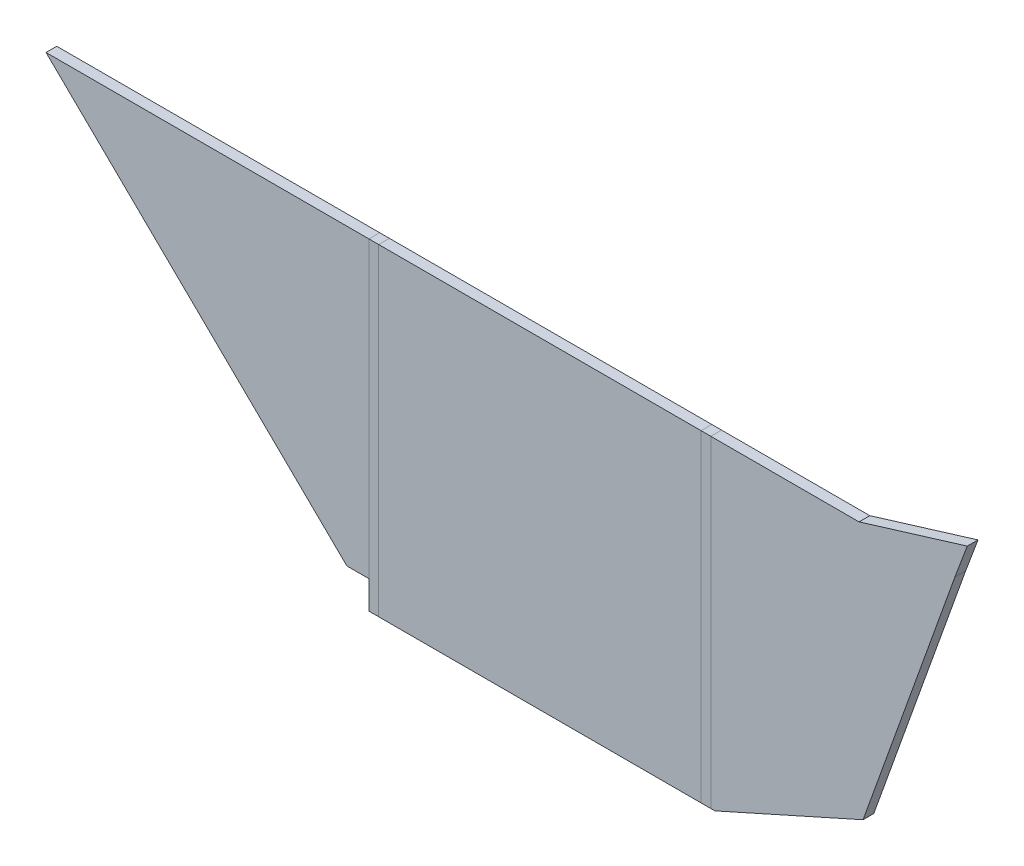
ISO-10303-21;
HEADER;
FILE_DESCRIPTION(('STEP AP214'),'2;1');
FILE_NAME('part.step','',(''),(''),'','','');
FILE_SCHEMA(('AUTOMOTIVE_DESIGN { 1 0 10303 214 1 1 1 1 }'));
ENDSEC;
DATA;
#1=APPLICATION_CONTEXT('core data for automotive mechanical design processes');
#2=APPLICATION_PROTOCOL_DEFINITION('international standard','automotive_design',2000,#1);
#3=PRODUCT_CONTEXT('',#1,'mechanical');
#4=PRODUCT('Part','Part','',(#3));
#5=PRODUCT_RELATED_PRODUCT_CATEGORY('part','',(#4));
#6=PRODUCT_DEFINITION_FORMATION('','',#4);
#7=PRODUCT_DEFINITION_CONTEXT('part definition',#1,'design');
#8=PRODUCT_DEFINITION('design','',#6,#7);
#9=PRODUCT_DEFINITION_SHAPE('','',#8);
#10=(LENGTH_UNIT() NAMED_UNIT(*) SI_UNIT(.MILLI.,.METRE.));
#11=(NAMED_UNIT(*) PLANE_ANGLE_UNIT() SI_UNIT($,.RADIAN.));
#12=(NAMED_UNIT(*) SI_UNIT($,.STERADIAN.) SOLID_ANGLE_UNIT());
#13=UNCERTAINTY_MEASURE_WITH_UNIT(LENGTH_MEASURE(1.E-05),#10,'distance_accuracy_value','');
#14=(GEOMETRIC_REPRESENTATION_CONTEXT(3) GLOBAL_UNCERTAINTY_ASSIGNED_CONTEXT((#13)) GLOBAL_UNIT_ASSIGNED_CONTEXT((#10,
#11,#12)) REPRESENTATION_CONTEXT('',''));
#15=CARTESIAN_POINT('',(0.,0.,0.));
#16=DIRECTION('',(0.,0.,1.));
#17=DIRECTION('',(1.,0.,0.));
#18=AXIS2_PLACEMENT_3D('',#15,#16,#17);
#19=CARTESIAN_POINT('',(-31.818563267408,30.,-1.00000000000001));
#20=DIRECTION('',(-1.,0.,0.));
#21=DIRECTION('',(0.,-1.,0.));
#22=AXIS2_PLACEMENT_3D('',#19,#20,#21);
#23=PLANE('',#22);
#24=DIRECTION('',(0.,-1.,0.));
#25=VECTOR('',#24,1.);
#26=CARTESIAN_POINT('',(-31.818563267408,30.,-1.00000000000001));
#27=LINE('',#26,#25);
#28=CARTESIAN_POINT('',(-31.818563267408,-24.77,-1.00000000000001));
#29=VERTEX_POINT('',#28);
#30=CARTESIAN_POINT('',(-31.818563267408,-30.,-1.00000000000001));
#31=VERTEX_POINT('',#30);
#32=EDGE_CURVE('E247',#29,#31,#27,.T.);
#33=ORIENTED_EDGE('',*,*,#32,.T.);
#34=DIRECTION('',(0.,0.,-1.));
#35=VECTOR('',#34,1.);
#36=CARTESIAN_POINT('',(-31.818563267408,-30.,-1.00000000000001));
#37=LINE('',#36,#35);
#38=CARTESIAN_POINT('',(-31.818563267408,-30.,1.));
#39=VERTEX_POINT('',#38);
#40=EDGE_CURVE('E253',#39,#31,#37,.T.);
#41=ORIENTED_EDGE('',*,*,#40,.F.);
#42=DIRECTION('',(0.,1.,0.));
#43=VECTOR('',#42,1.);
#44=CARTESIAN_POINT('',(-31.818563267408,0.,1.));
#45=LINE('',#44,#43);
#46=CARTESIAN_POINT('',(-31.818563267408,-24.77,1.));
#47=VERTEX_POINT('',#46);
#48=EDGE_CURVE('E254',#47,#39,#45,.F.);
#49=ORIENTED_EDGE('',*,*,#48,.F.);
#50=DIRECTION('',(0.,0.,1.));
#51=VECTOR('',#50,1.);
#52=CARTESIAN_POINT('',(-31.818563267408,-24.77,0.99999999999998));
#53=LINE('',#52,#51);
#54=EDGE_CURVE('E239',#29,#47,#53,.T.);
#55=ORIENTED_EDGE('',*,*,#54,.F.);
#56=EDGE_LOOP('',(#33,#41,#49,#55));
#57=FACE_BOUND('',#56,.T.);
#58=ADVANCED_FACE('F45',(#57),#23,.T.);
#59=CARTESIAN_POINT('',(30.,-30.,-1.));
#60=DIRECTION('',(0.,-1.,0.));
#61=DIRECTION('',(0.,0.,-1.));
#62=AXIS2_PLACEMENT_3D('',#59,#60,#61);
#63=PLANE('',#62);
#64=DIRECTION('',(-1.,0.,0.));
#65=VECTOR('',#64,1.);
#66=CARTESIAN_POINT('',(30.,-30.,1.));
#67=LINE('',#66,#65);
#68=CARTESIAN_POINT('',(30.,-30.,1.));
#69=VERTEX_POINT('',#68);
#70=CARTESIAN_POINT('',(-30.,-30.,1.));
#71=VERTEX_POINT('',#70);
#72=EDGE_CURVE('E267',#69,#71,#67,.T.);
#73=ORIENTED_EDGE('',*,*,#72,.T.);
#74=DIRECTION('',(0.,0.,1.));
#75=VECTOR('',#74,1.);
#76=CARTESIAN_POINT('',(-30.,-30.,-1.));
#77=LINE('',#76,#75);
#78=CARTESIAN_POINT('',(-30.,-30.,-1.00000000000001));
#79=VERTEX_POINT('',#78);
#80=EDGE_CURVE('E283',#79,#71,#77,.T.);
#81=ORIENTED_EDGE('',*,*,#80,.F.);
#82=DIRECTION('',(-1.,0.,0.));
#83=VECTOR('',#82,1.);
#84=CARTESIAN_POINT('',(30.,-30.,-1.));
#85=LINE('',#84,#83);
#86=CARTESIAN_POINT('',(30.,-30.,-0.99999999999999));
#87=VERTEX_POINT('',#86);
#88=EDGE_CURVE('E266',#87,#79,#85,.T.);
#89=ORIENTED_EDGE('',*,*,#88,.F.);
#90=DIRECTION('',(0.,0.,1.));
#91=VECTOR('',#90,1.);
#92=CARTESIAN_POINT('',(30.,-30.,-1.));
#93=LINE('',#92,#91);
#94=EDGE_CURVE('E289',#87,#69,#93,.T.);
#95=ORIENTED_EDGE('',*,*,#94,.T.);
#96=EDGE_LOOP('',(#73,#81,#89,#95));
#97=FACE_BOUND('',#96,.T.);
#98=ADVANCED_FACE('F299',(#97),#63,.T.);
#99=CARTESIAN_POINT('',(30.,30.,-1.));
#100=DIRECTION('',(0.,1.,0.));
#101=DIRECTION('',(0.,0.,1.));
#102=AXIS2_PLACEMENT_3D('',#99,#100,#101);
#103=PLANE('',#102);
#104=DIRECTION('',(1.,0.,0.));
#105=VECTOR('',#104,1.);
#106=CARTESIAN_POINT('',(30.,30.,1.));
#107=LINE('',#106,#105);
#108=CARTESIAN_POINT('',(-30.,30.,1.));
#109=VERTEX_POINT('',#108);
#110=CARTESIAN_POINT('',(30.,30.,1.00000000000001));
#111=VERTEX_POINT('',#110);
#112=EDGE_CURVE('E262',#109,#111,#107,.T.);
#113=ORIENTED_EDGE('',*,*,#112,.T.);
#114=DIRECTION('',(0.,0.,1.));
#115=VECTOR('',#114,1.);
#116=CARTESIAN_POINT('',(30.,30.,-1.));
#117=LINE('',#116,#115);
#118=CARTESIAN_POINT('',(30.,30.,-0.99999999999999));
#119=VERTEX_POINT('',#118);
#120=EDGE_CURVE('E11',#119,#111,#117,.T.);
#121=ORIENTED_EDGE('',*,*,#120,.F.);
#122=DIRECTION('',(1.,0.,0.));
#123=VECTOR('',#122,1.);
#124=CARTESIAN_POINT('',(30.,30.,-1.));
#125=LINE('',#124,#123);
#126=CARTESIAN_POINT('',(-30.,30.,-1.00000000000001));
#127=VERTEX_POINT('',#126);
#128=EDGE_CURVE('E263',#127,#119,#125,.T.);
#129=ORIENTED_EDGE('',*,*,#128,.F.);
#130=DIRECTION('',(0.,0.,1.));
#131=VECTOR('',#130,1.);
#132=CARTESIAN_POINT('',(-30.,30.,-1.));
#133=LINE('',#132,#131);
#134=EDGE_CURVE('E277',#127,#109,#133,.T.);
#135=ORIENTED_EDGE('',*,*,#134,.T.);
#136=EDGE_LOOP('',(#113,#121,#129,#135));
#137=FACE_BOUND('',#136,.T.);
#138=ADVANCED_FACE('F47',(#137),#103,.T.);
#139=CARTESIAN_POINT('',(0.,0.,-1.));
#140=DIRECTION('',(0.,0.,-1.));
#141=DIRECTION('',(1.,0.,0.));
#142=AXIS2_PLACEMENT_3D('',#139,#140,#141);
#143=PLANE('',#142);
#144=DIRECTION('',(0.,1.,0.));
#145=VECTOR('',#144,1.);
#146=CARTESIAN_POINT('',(-30.,-30.,-1.));
#147=LINE('',#146,#145);
#148=EDGE_CURVE('E270',#79,#127,#147,.T.);
#149=ORIENTED_EDGE('',*,*,#148,.T.);
#150=ORIENTED_EDGE('',*,*,#128,.T.);
#151=DIRECTION('',(0.,-1.,0.));
#152=VECTOR('',#151,1.);
#153=CARTESIAN_POINT('',(30.,-30.,-1.));
#154=LINE('',#153,#152);
#155=EDGE_CURVE('E286',#119,#87,#154,.T.);
#156=ORIENTED_EDGE('',*,*,#155,.T.);
#157=ORIENTED_EDGE('',*,*,#88,.T.);
#158=EDGE_LOOP('',(#149,#150,#156,#157));
#159=FACE_BOUND('',#158,.T.);
#160=ADVANCED_FACE('F315',(#159),#143,.T.);
#161=CARTESIAN_POINT('',(0.,0.,1.));
#162=DIRECTION('',(0.,0.,-1.));
#163=DIRECTION('',(1.,0.,0.));
#164=AXIS2_PLACEMENT_3D('',#161,#162,#163);
#165=PLANE('',#164);
#166=DIRECTION('',(0.,1.,0.));
#167=VECTOR('',#166,1.);
#168=CARTESIAN_POINT('',(-30.,-30.,1.));
#169=LINE('',#168,#167);
#170=EDGE_CURVE('E280',#71,#109,#169,.T.);
#171=ORIENTED_EDGE('',*,*,#170,.F.);
#172=ORIENTED_EDGE('',*,*,#72,.F.);
#173=DIRECTION('',(0.,-1.,0.));
#174=VECTOR('',#173,1.);
#175=CARTESIAN_POINT('',(30.,-30.,1.));
#176=LINE('',#175,#174);
#177=EDGE_CURVE('E53',#111,#69,#176,.T.);
#178=ORIENTED_EDGE('',*,*,#177,.F.);
#179=ORIENTED_EDGE('',*,*,#112,.F.);
#180=EDGE_LOOP('',(#171,#172,#178,#179));
#181=FACE_BOUND('',#180,.T.);
#182=ADVANCED_FACE('F303',(#181),#165,.F.);
#183=CARTESIAN_POINT('',(-31.818563267408,30.,-1.00000000000001));
#184=DIRECTION('',(0.,1.,0.));
#185=DIRECTION('',(-1.,0.,0.));
#186=AXIS2_PLACEMENT_3D('',#183,#184,#185);
#187=PLANE('',#186);
#188=ORIENTED_EDGE('',*,*,#134,.F.);
#189=DIRECTION('',(-1.,0.,0.));
#190=VECTOR('',#189,1.);
#191=CARTESIAN_POINT('',(-31.818563267408,30.,-1.00000000000001));
#192=LINE('',#191,#190);
#193=CARTESIAN_POINT('',(-31.818563267408,30.,-1.00000000000001));
#194=VERTEX_POINT('',#193);
#195=EDGE_CURVE('E244',#127,#194,#192,.T.);
#196=ORIENTED_EDGE('',*,*,#195,.T.);
#197=DIRECTION('',(0.,0.,-1.));
#198=VECTOR('',#197,1.);
#199=CARTESIAN_POINT('',(-31.818563267408,30.,0.999999999999994));
#200=LINE('',#199,#198);
#201=CARTESIAN_POINT('',(-31.818563267408,30.,0.999999999999984));
#202=VERTEX_POINT('',#201);
#203=EDGE_CURVE('E234',#202,#194,#200,.T.);
#204=ORIENTED_EDGE('',*,*,#203,.F.);
#205=DIRECTION('',(1.,0.,0.));
#206=VECTOR('',#205,1.);
#207=CARTESIAN_POINT('',(-30.909281633704,30.,1.));
#208=LINE('',#207,#206);
#209=EDGE_CURVE('E217',#109,#202,#208,.F.);
#210=ORIENTED_EDGE('',*,*,#209,.F.);
#211=EDGE_LOOP('',(#188,#196,#204,#210));
#212=FACE_BOUND('',#211,.T.);
#213=ADVANCED_FACE('F341',(#212),#187,.T.);
#214=CARTESIAN_POINT('',(-30.,-30.,-1.00000000000001));
#215=DIRECTION('',(0.,-1.,0.));
#216=DIRECTION('',(1.,0.,0.));
#217=AXIS2_PLACEMENT_3D('',#214,#215,#216);
#218=PLANE('',#217);
#219=DIRECTION('',(1.,0.,0.));
#220=VECTOR('',#219,1.);
#221=CARTESIAN_POINT('',(-30.909281633704,-30.,1.));
#222=LINE('',#221,#220);
#223=EDGE_CURVE('E248',#39,#71,#222,.T.);
#224=ORIENTED_EDGE('',*,*,#223,.F.);
#225=ORIENTED_EDGE('',*,*,#40,.T.);
#226=DIRECTION('',(1.,0.,0.));
#227=VECTOR('',#226,1.);
#228=CARTESIAN_POINT('',(-30.,-30.,-1.00000000000001));
#229=LINE('',#228,#227);
#230=EDGE_CURVE('E251',#31,#79,#229,.T.);
#231=ORIENTED_EDGE('',*,*,#230,.T.);
#232=ORIENTED_EDGE('',*,*,#80,.T.);
#233=EDGE_LOOP('',(#224,#225,#231,#232));
#234=FACE_BOUND('',#233,.T.);
#235=ADVANCED_FACE('F306',(#234),#218,.T.);
#236=CARTESIAN_POINT('',(-30.909281633704,0.,-1.));
#237=DIRECTION('',(0.,0.,-1.));
#238=DIRECTION('',(1.,0.,0.));
#239=AXIS2_PLACEMENT_3D('',#236,#237,#238);
#240=PLANE('',#239);
#241=DIRECTION('',(0.,-1.,0.));
#242=VECTOR('',#241,1.);
#243=CARTESIAN_POINT('',(-31.818563267408,-30.,-1.00000000000001));
#244=LINE('',#243,#242);
#245=EDGE_CURVE('E208',#194,#29,#244,.T.);
#246=ORIENTED_EDGE('',*,*,#245,.F.);
#247=ORIENTED_EDGE('',*,*,#195,.F.);
#248=ORIENTED_EDGE('',*,*,#148,.F.);
#249=ORIENTED_EDGE('',*,*,#230,.F.);
#250=ORIENTED_EDGE('',*,*,#32,.F.);
#251=EDGE_LOOP('',(#246,#247,#248,#249,#250));
#252=FACE_BOUND('',#251,.T.);
#253=ADVANCED_FACE('F312',(#252),#240,.T.);
#254=CARTESIAN_POINT('',(-30.909281633704,0.,1.));
#255=DIRECTION('',(0.,0.,-1.));
#256=DIRECTION('',(1.,0.,0.));
#257=AXIS2_PLACEMENT_3D('',#254,#255,#256);
#258=PLANE('',#257);
#259=DIRECTION('',(0.,1.,0.));
#260=VECTOR('',#259,1.);
#261=CARTESIAN_POINT('',(-31.818563267408,-30.,0.999999999999984));
#262=LINE('',#261,#260);
#263=EDGE_CURVE('E237',#47,#202,#262,.T.);
#264=ORIENTED_EDGE('',*,*,#263,.F.);
#265=ORIENTED_EDGE('',*,*,#48,.T.);
#266=ORIENTED_EDGE('',*,*,#223,.T.);
#267=ORIENTED_EDGE('',*,*,#170,.T.);
#268=ORIENTED_EDGE('',*,*,#209,.T.);
#269=EDGE_LOOP('',(#264,#265,#266,#267,#268));
#270=FACE_BOUND('',#269,.T.);
#271=ADVANCED_FACE('F343',(#270),#258,.F.);
#272=CARTESIAN_POINT('',(-91.9185865207437,30.,0.999999999999567));
#273=DIRECTION('',(0.699205020159439,0.714921212291143,0.));
#274=DIRECTION('',(-0.714921212291143,0.699205020159439,0.));
#275=AXIS2_PLACEMENT_3D('',#272,#273,#274);
#276=PLANE('',#275);
#277=DIRECTION('',(-0.714921212291143,0.699205020159439,0.));
#278=VECTOR('',#277,1.);
#279=CARTESIAN_POINT('',(-91.9185865207437,30.,-1.00000000000043));
#280=LINE('',#279,#278);
#281=CARTESIAN_POINT('',(-35.9175086276571,-24.77,-1.00000000000005));
#282=VERTEX_POINT('',#281);
#283=CARTESIAN_POINT('',(-91.9185865207437,30.,-1.00000000000044));
#284=VERTEX_POINT('',#283);
#285=EDGE_CURVE('E231',#282,#284,#280,.T.);
#286=ORIENTED_EDGE('',*,*,#285,.F.);
#287=DIRECTION('',(0.,0.,-1.));
#288=VECTOR('',#287,1.);
#289=CARTESIAN_POINT('',(-35.9175086276571,-24.77,0.999999999999949));
#290=LINE('',#289,#288);
#291=CARTESIAN_POINT('',(-35.9175086276571,-24.77,0.999999999999949));
#292=VERTEX_POINT('',#291);
#293=EDGE_CURVE('E214',#282,#292,#290,.F.);
#294=ORIENTED_EDGE('',*,*,#293,.T.);
#295=DIRECTION('',(-0.714921212291143,0.699205020159439,0.));
#296=VECTOR('',#295,1.);
#297=CARTESIAN_POINT('',(-91.9185865207437,30.,0.999999999999567));
#298=LINE('',#297,#296);
#299=CARTESIAN_POINT('',(-91.9185865207437,30.,0.999999999999564));
#300=VERTEX_POINT('',#299);
#301=EDGE_CURVE('E220',#292,#300,#298,.T.);
#302=ORIENTED_EDGE('',*,*,#301,.T.);
#303=DIRECTION('',(0.,0.,1.));
#304=VECTOR('',#303,1.);
#305=CARTESIAN_POINT('',(-91.9185865207437,30.,-1.00000000000043));
#306=LINE('',#305,#304);
#307=EDGE_CURVE('E228',#284,#300,#306,.T.);
#308=ORIENTED_EDGE('',*,*,#307,.F.);
#309=EDGE_LOOP('',(#286,#294,#302,#308));
#310=FACE_BOUND('',#309,.T.);
#311=ADVANCED_FACE('F357',(#310),#276,.F.);
#312=CARTESIAN_POINT('',(-15.5272616553384,0.,-0.999999999999904));
#313=DIRECTION('',(0.,0.,1.));
#314=DIRECTION('',(-1.,0.,0.));
#315=AXIS2_PLACEMENT_3D('',#312,#313,#314);
#316=PLANE('',#315);
#317=DIRECTION('',(1.,0.,0.));
#318=VECTOR('',#317,1.);
#319=CARTESIAN_POINT('',(-61.8685748940759,-24.77,-1.00000000000023));
#320=LINE('',#319,#318);
#321=EDGE_CURVE('E218',#29,#282,#320,.F.);
#322=ORIENTED_EDGE('',*,*,#321,.T.);
#323=ORIENTED_EDGE('',*,*,#285,.T.);
#324=DIRECTION('',(-1.,0.,0.));
#325=VECTOR('',#324,1.);
#326=CARTESIAN_POINT('',(-15.5272616553384,30.,-0.999999999999904));
#327=LINE('',#326,#325);
#328=EDGE_CURVE('E226',#194,#284,#327,.T.);
#329=ORIENTED_EDGE('',*,*,#328,.F.);
#330=ORIENTED_EDGE('',*,*,#245,.T.);
#331=EDGE_LOOP('',(#322,#323,#329,#330));
#332=FACE_BOUND('',#331,.T.);
#333=ADVANCED_FACE('F358',(#332),#316,.F.);
#334=CARTESIAN_POINT('',(-91.9185865207437,30.,-1.00000000000043));
#335=DIRECTION('',(0.,-1.,0.));
#336=DIRECTION('',(0.86602540378444,0.,-0.499999999999998));
#337=AXIS2_PLACEMENT_3D('',#334,#335,#336);
#338=PLANE('',#337);
#339=ORIENTED_EDGE('',*,*,#203,.T.);
#340=ORIENTED_EDGE('',*,*,#328,.T.);
#341=ORIENTED_EDGE('',*,*,#307,.T.);
#342=DIRECTION('',(1.,0.,0.));
#343=VECTOR('',#342,1.);
#344=CARTESIAN_POINT('',(-91.9185865207437,30.,0.999999999999564));
#345=LINE('',#344,#343);
#346=EDGE_CURVE('E224',#202,#300,#345,.F.);
#347=ORIENTED_EDGE('',*,*,#346,.F.);
#348=EDGE_LOOP('',(#339,#340,#341,#347));
#349=FACE_BOUND('',#348,.T.);
#350=ADVANCED_FACE('F352',(#349),#338,.F.);
#351=CARTESIAN_POINT('',(-15.5272616553384,0.,1.00000000000009));
#352=DIRECTION('',(0.,0.,1.));
#353=DIRECTION('',(-1.,0.,0.));
#354=AXIS2_PLACEMENT_3D('',#351,#352,#353);
#355=PLANE('',#354);
#356=ORIENTED_EDGE('',*,*,#263,.T.);
#357=ORIENTED_EDGE('',*,*,#346,.T.);
#358=ORIENTED_EDGE('',*,*,#301,.F.);
#359=DIRECTION('',(-1.,0.,0.));
#360=VECTOR('',#359,1.);
#361=CARTESIAN_POINT('',(-31.818563267408,-24.77,0.99999999999998));
#362=LINE('',#361,#360);
#363=EDGE_CURVE('E68',#47,#292,#362,.T.);
#364=ORIENTED_EDGE('',*,*,#363,.F.);
#365=EDGE_LOOP('',(#356,#357,#358,#364));
#366=FACE_BOUND('',#365,.T.);
#367=ADVANCED_FACE('F354',(#366),#355,.T.);
#368=CARTESIAN_POINT('',(-31.818563267408,-24.77,0.99999999999998));
#369=DIRECTION('',(0.,1.,0.));
#370=DIRECTION('',(-1.,0.,0.));
#371=AXIS2_PLACEMENT_3D('',#368,#369,#370);
#372=PLANE('',#371);
#373=ORIENTED_EDGE('',*,*,#54,.T.);
#374=ORIENTED_EDGE('',*,*,#363,.T.);
#375=ORIENTED_EDGE('',*,*,#293,.F.);
#376=ORIENTED_EDGE('',*,*,#321,.F.);
#377=EDGE_LOOP('',(#373,#374,#375,#376));
#378=FACE_BOUND('',#377,.T.);
#379=ADVANCED_FACE('F347',(#378),#372,.F.);
#380=CARTESIAN_POINT('',(30.,-30.,-0.99999999999999));
#381=DIRECTION('',(0.,-1.,0.));
#382=DIRECTION('',(1.,0.,0.));
#383=AXIS2_PLACEMENT_3D('',#380,#381,#382);
#384=PLANE('',#383);
#385=ORIENTED_EDGE('',*,*,#94,.F.);
#386=DIRECTION('',(1.,0.,0.));
#387=VECTOR('',#386,1.);
#388=CARTESIAN_POINT('',(30.,-30.,-0.99999999999999));
#389=LINE('',#388,#387);
#390=CARTESIAN_POINT('',(31.818563267408,-30.,-0.99999999999999));
#391=VERTEX_POINT('',#390);
#392=EDGE_CURVE('E203',#87,#391,#389,.T.);
#393=ORIENTED_EDGE('',*,*,#392,.T.);
#394=DIRECTION('',(0.,0.,-1.));
#395=VECTOR('',#394,1.);
#396=CARTESIAN_POINT('',(31.818563267408,-30.,1.00000000000001));
#397=LINE('',#396,#395);
#398=CARTESIAN_POINT('',(31.818563267408,-30.,1.00000000000001));
#399=VERTEX_POINT('',#398);
#400=EDGE_CURVE('E187',#399,#391,#397,.T.);
#401=ORIENTED_EDGE('',*,*,#400,.F.);
#402=DIRECTION('',(1.,0.,0.));
#403=VECTOR('',#402,1.);
#404=CARTESIAN_POINT('',(30.909281633704,-30.,1.));
#405=LINE('',#404,#403);
#406=EDGE_CURVE('E209',#69,#399,#405,.T.);
#407=ORIENTED_EDGE('',*,*,#406,.F.);
#408=EDGE_LOOP('',(#385,#393,#401,#407));
#409=FACE_BOUND('',#408,.T.);
#410=ADVANCED_FACE('F324',(#409),#384,.T.);
#411=CARTESIAN_POINT('',(31.818563267408,30.,-0.99999999999999));
#412=DIRECTION('',(0.,1.,0.));
#413=DIRECTION('',(-1.,0.,0.));
#414=AXIS2_PLACEMENT_3D('',#411,#412,#413);
#415=PLANE('',#414);
#416=DIRECTION('',(1.,0.,0.));
#417=VECTOR('',#416,1.);
#418=CARTESIAN_POINT('',(30.909281633704,30.,1.));
#419=LINE('',#418,#417);
#420=CARTESIAN_POINT('',(31.818563267408,30.,1.));
#421=VERTEX_POINT('',#420);
#422=EDGE_CURVE('E60',#421,#111,#419,.F.);
#423=ORIENTED_EDGE('',*,*,#422,.F.);
#424=DIRECTION('',(0.,0.,1.));
#425=VECTOR('',#424,1.);
#426=CARTESIAN_POINT('',(31.818563267408,30.,-0.99999999999999));
#427=LINE('',#426,#425);
#428=CARTESIAN_POINT('',(31.818563267408,30.,-0.99999999999999));
#429=VERTEX_POINT('',#428);
#430=EDGE_CURVE('E197',#429,#421,#427,.T.);
#431=ORIENTED_EDGE('',*,*,#430,.F.);
#432=DIRECTION('',(-1.,0.,0.));
#433=VECTOR('',#432,1.);
#434=CARTESIAN_POINT('',(31.818563267408,30.,-0.99999999999999));
#435=LINE('',#434,#433);
#436=EDGE_CURVE('E206',#429,#119,#435,.T.);
#437=ORIENTED_EDGE('',*,*,#436,.T.);
#438=ORIENTED_EDGE('',*,*,#120,.T.);
#439=EDGE_LOOP('',(#423,#431,#437,#438));
#440=FACE_BOUND('',#439,.T.);
#441=ADVANCED_FACE('F338',(#440),#415,.T.);
#442=CARTESIAN_POINT('',(30.909281633704,0.,-1.));
#443=DIRECTION('',(0.,0.,-1.));
#444=DIRECTION('',(1.,0.,0.));
#445=AXIS2_PLACEMENT_3D('',#442,#443,#444);
#446=PLANE('',#445);
#447=DIRECTION('',(0.,1.,0.));
#448=VECTOR('',#447,1.);
#449=CARTESIAN_POINT('',(31.818563267408,-30.,-0.999999999999994));
#450=LINE('',#449,#448);
#451=EDGE_CURVE('E200',#391,#429,#450,.T.);
#452=ORIENTED_EDGE('',*,*,#451,.F.);
#453=ORIENTED_EDGE('',*,*,#392,.F.);
#454=ORIENTED_EDGE('',*,*,#155,.F.);
#455=ORIENTED_EDGE('',*,*,#436,.F.);
#456=EDGE_LOOP('',(#452,#453,#454,#455));
#457=FACE_BOUND('',#456,.T.);
#458=ADVANCED_FACE('F322',(#457),#446,.T.);
#459=CARTESIAN_POINT('',(30.909281633704,0.,1.));
#460=DIRECTION('',(0.,0.,-1.));
#461=DIRECTION('',(1.,0.,0.));
#462=AXIS2_PLACEMENT_3D('',#459,#460,#461);
#463=PLANE('',#462);
#464=DIRECTION('',(0.,-1.,0.));
#465=VECTOR('',#464,1.);
#466=CARTESIAN_POINT('',(31.818563267408,-30.,1.00000000000001));
#467=LINE('',#466,#465);
#468=EDGE_CURVE('E192',#421,#399,#467,.T.);
#469=ORIENTED_EDGE('',*,*,#468,.F.);
#470=ORIENTED_EDGE('',*,*,#422,.T.);
#471=ORIENTED_EDGE('',*,*,#177,.T.);
#472=ORIENTED_EDGE('',*,*,#406,.T.);
#473=EDGE_LOOP('',(#469,#470,#471,#472));
#474=FACE_BOUND('',#473,.T.);
#475=ADVANCED_FACE('F291',(#474),#463,.F.);
#476=CARTESIAN_POINT('',(32.568563267408,-30.,-0.99999999999997));
#477=DIRECTION('',(-0.409000661813368,0.912534086287316,0.));
#478=DIRECTION('',(-0.807339616520931,-0.361852167965202,0.466117744925806));
#479=AXIS2_PLACEMENT_3D('',#476,#477,#478);
#480=PLANE('',#479);
#481=DIRECTION('',(0.912534086287316,0.409000661813368,0.));
#482=VECTOR('',#481,1.);
#483=CARTESIAN_POINT('',(32.568563267408,-30.,1.00000000000003));
#484=LINE('',#483,#482);
#485=CARTESIAN_POINT('',(32.568563267408,-30.,1.00000000000003));
#486=VERTEX_POINT('',#485);
#487=CARTESIAN_POINT('',(60.1453433550107,-17.64,1.00000000000023));
#488=VERTEX_POINT('',#487);
#489=EDGE_CURVE('E177',#486,#488,#484,.T.);
#490=ORIENTED_EDGE('',*,*,#489,.F.);
#491=DIRECTION('',(0.,0.,1.));
#492=VECTOR('',#491,1.);
#493=CARTESIAN_POINT('',(32.568563267408,-30.,-0.99999999999997));
#494=LINE('',#493,#492);
#495=CARTESIAN_POINT('',(32.568563267408,-30.,-0.99999999999997));
#496=VERTEX_POINT('',#495);
#497=EDGE_CURVE('E186',#496,#486,#494,.T.);
#498=ORIENTED_EDGE('',*,*,#497,.F.);
#499=DIRECTION('',(0.912534086287316,0.409000661813368,0.));
#500=VECTOR('',#499,1.);
#501=CARTESIAN_POINT('',(32.568563267408,-30.,-0.99999999999997));
#502=LINE('',#501,#500);
#503=CARTESIAN_POINT('',(60.1453433550107,-17.64,-0.999999999999779));
#504=VERTEX_POINT('',#503);
#505=EDGE_CURVE('E179',#496,#504,#502,.T.);
#506=ORIENTED_EDGE('',*,*,#505,.T.);
#507=DIRECTION('',(0.,0.,1.));
#508=VECTOR('',#507,1.);
#509=CARTESIAN_POINT('',(60.1453433550107,-17.64,-0.999999999999779));
#510=LINE('',#509,#508);
#511=EDGE_CURVE('E164',#504,#488,#510,.T.);
#512=ORIENTED_EDGE('',*,*,#511,.T.);
#513=EDGE_LOOP('',(#490,#498,#506,#512));
#514=FACE_BOUND('',#513,.T.);
#515=ADVANCED_FACE('F175',(#514),#480,.F.);
#516=CARTESIAN_POINT('',(79.538563267408,36.1629106235044,-0.99999999999964));
#517=DIRECTION('',(-0.292610279033471,0.95623178393314,0.));
#518=DIRECTION('',(-0.837128935171555,-0.256164389662943,0.483316616067719));
#519=AXIS2_PLACEMENT_3D('',#516,#517,#518);
#520=PLANE('',#519);
#521=DIRECTION('',(0.95623178393314,0.292610279033471,0.));
#522=VECTOR('',#521,1.);
#523=CARTESIAN_POINT('',(79.538563267408,36.1629106235044,1.00000000000035));
#524=LINE('',#523,#522);
#525=CARTESIAN_POINT('',(59.398563267408,30.,1.00000000000021));
#526=VERTEX_POINT('',#525);
#527=CARTESIAN_POINT('',(79.538563267408,36.1629106235044,1.00000000000035));
#528=VERTEX_POINT('',#527);
#529=EDGE_CURVE('E758',#526,#528,#524,.T.);
#530=ORIENTED_EDGE('',*,*,#529,.T.);
#531=DIRECTION('',(0.,0.,1.));
#532=VECTOR('',#531,1.);
#533=CARTESIAN_POINT('',(79.538563267408,36.1629106235044,-0.99999999999964));
#534=LINE('',#533,#532);
#535=CARTESIAN_POINT('',(79.538563267408,36.1629106235044,-0.99999999999964));
#536=VERTEX_POINT('',#535);
#537=EDGE_CURVE('E753',#536,#528,#534,.T.);
#538=ORIENTED_EDGE('',*,*,#537,.F.);
#539=DIRECTION('',(0.95623178393314,0.292610279033471,0.));
#540=VECTOR('',#539,1.);
#541=CARTESIAN_POINT('',(79.538563267408,36.1629106235044,-0.99999999999964));
#542=LINE('',#541,#540);
#543=CARTESIAN_POINT('',(59.398563267408,30.,-0.999999999999782));
#544=VERTEX_POINT('',#543);
#545=EDGE_CURVE('E189',#544,#536,#542,.T.);
#546=ORIENTED_EDGE('',*,*,#545,.F.);
#547=DIRECTION('',(0.,0.,1.));
#548=VECTOR('',#547,1.);
#549=CARTESIAN_POINT('',(59.398563267408,30.,-0.999999999999782));
#550=LINE('',#549,#548);
#551=EDGE_CURVE('E212',#544,#526,#550,.T.);
#552=ORIENTED_EDGE('',*,*,#551,.T.);
#553=EDGE_LOOP('',(#530,#538,#546,#552));
#554=FACE_BOUND('',#553,.T.);
#555=ADVANCED_FACE('F476',(#554),#520,.T.);
#556=CARTESIAN_POINT('',(59.3953433550107,-17.64,-0.999999999999782));
#557=DIRECTION('',(0.936517156196769,-0.350621756525627,0.));
#558=DIRECTION('',(0.,0.,1.));
#559=AXIS2_PLACEMENT_3D('',#556,#557,#558);
#560=PLANE('',#559);
#561=DIRECTION('',(0.,0.,-1.));
#562=VECTOR('',#561,1.);
#563=CARTESIAN_POINT('',(77.2312370920938,30.,1.00000000000031));
#564=LINE('',#563,#562);
#565=CARTESIAN_POINT('',(77.2312370920938,30.,1.00000000000033));
#566=VERTEX_POINT('',#565);
#567=CARTESIAN_POINT('',(77.2312370920938,30.,-0.999999999999654));
#568=VERTEX_POINT('',#567);
#569=EDGE_CURVE('E167',#566,#568,#564,.T.);
#570=ORIENTED_EDGE('',*,*,#569,.T.);
#571=DIRECTION('',(-0.350621756525627,-0.936517156196769,0.));
#572=VECTOR('',#571,1.);
#573=CARTESIAN_POINT('',(59.3953433550107,-17.64,-0.999999999999782));
#574=LINE('',#573,#572);
#575=EDGE_CURVE('E171',#536,#568,#574,.T.);
#576=ORIENTED_EDGE('',*,*,#575,.F.);
#577=ORIENTED_EDGE('',*,*,#537,.T.);
#578=DIRECTION('',(-0.350621756525627,-0.936517156196769,0.));
#579=VECTOR('',#578,1.);
#580=CARTESIAN_POINT('',(59.3953433550107,-17.64,1.00000000000022));
#581=LINE('',#580,#579);
#582=EDGE_CURVE('E329',#528,#566,#581,.T.);
#583=ORIENTED_EDGE('',*,*,#582,.T.);
#584=EDGE_LOOP('',(#570,#576,#577,#583));
#585=FACE_BOUND('',#584,.T.);
#586=ADVANCED_FACE('F485',(#585),#560,.T.);
#587=CARTESIAN_POINT('',(60.1453433550107,-17.64,-0.999999999999779));
#588=DIRECTION('',(-0.941292928617428,0.337590910029915,0.));
#589=DIRECTION('',(0.,0.,-1.));
#590=AXIS2_PLACEMENT_3D('',#587,#588,#589);
#591=PLANE('',#590);
#592=DIRECTION('',(0.337590910029915,0.941292928617428,0.));
#593=VECTOR('',#592,1.);
#594=CARTESIAN_POINT('',(60.1453433550107,-17.64,1.00000000000023));
#595=LINE('',#594,#593);
#596=EDGE_CURVE('E161',#488,#566,#595,.T.);
#597=ORIENTED_EDGE('',*,*,#596,.F.);
#598=ORIENTED_EDGE('',*,*,#511,.F.);
#599=DIRECTION('',(0.337590910029915,0.941292928617428,0.));
#600=VECTOR('',#599,1.);
#601=CARTESIAN_POINT('',(60.1453433550107,-17.64,-0.999999999999779));
#602=LINE('',#601,#600);
#603=EDGE_CURVE('E180',#504,#568,#602,.T.);
#604=ORIENTED_EDGE('',*,*,#603,.T.);
#605=ORIENTED_EDGE('',*,*,#569,.F.);
#606=EDGE_LOOP('',(#597,#598,#604,#605));
#607=FACE_BOUND('',#606,.T.);
#608=ADVANCED_FACE('F163',(#607),#591,.F.);
#609=CARTESIAN_POINT('',(15.5272616553384,0.,-1.0000000000001));
#610=DIRECTION('',(0.,0.,-1.));
#611=DIRECTION('',(1.,0.,0.));
#612=AXIS2_PLACEMENT_3D('',#609,#610,#611);
#613=PLANE('',#612);
#614=ORIENTED_EDGE('',*,*,#603,.F.);
#615=ORIENTED_EDGE('',*,*,#505,.F.);
#616=DIRECTION('',(1.,0.,0.));
#617=VECTOR('',#616,1.);
#618=CARTESIAN_POINT('',(31.3932870591229,-30.,-0.999999999999994));
#619=LINE('',#618,#617);
#620=EDGE_CURVE('E327',#496,#391,#619,.F.);
#621=ORIENTED_EDGE('',*,*,#620,.T.);
#622=ORIENTED_EDGE('',*,*,#451,.T.);
#623=DIRECTION('',(-1.,0.,0.));
#624=VECTOR('',#623,1.);
#625=CARTESIAN_POINT('',(100.238586520744,30.,-0.999999999999519));
#626=LINE('',#625,#624);
#627=EDGE_CURVE('E336',#429,#544,#626,.F.);
#628=ORIENTED_EDGE('',*,*,#627,.T.);
#629=ORIENTED_EDGE('',*,*,#545,.T.);
#630=ORIENTED_EDGE('',*,*,#575,.T.);
#631=EDGE_LOOP('',(#614,#615,#621,#622,#628,#629,#630));
#632=FACE_BOUND('',#631,.T.);
#633=ADVANCED_FACE('F504',(#632),#613,.T.);
#634=CARTESIAN_POINT('',(31.818563267408,-30.,-1.7366));
#635=DIRECTION('',(0.,-1.,0.));
#636=DIRECTION('',(0.86602540378444,0.,-0.499999999999998));
#637=AXIS2_PLACEMENT_3D('',#634,#635,#636);
#638=PLANE('',#637);
#639=ORIENTED_EDGE('',*,*,#400,.T.);
#640=ORIENTED_EDGE('',*,*,#620,.F.);
#641=ORIENTED_EDGE('',*,*,#497,.T.);
#642=DIRECTION('',(-1.,0.,0.));
#643=VECTOR('',#642,1.);
#644=CARTESIAN_POINT('',(15.5272616553384,-30.,0.999999999999897));
#645=LINE('',#644,#643);
#646=EDGE_CURVE('E184',#486,#399,#645,.T.);
#647=ORIENTED_EDGE('',*,*,#646,.T.);
#648=EDGE_LOOP('',(#639,#640,#641,#647));
#649=FACE_BOUND('',#648,.T.);
#650=ADVANCED_FACE('F326',(#649),#638,.T.);
#651=CARTESIAN_POINT('',(15.5272616553384,0.,0.999999999999897));
#652=DIRECTION('',(0.,0.,-1.));
#653=DIRECTION('',(1.,0.,0.));
#654=AXIS2_PLACEMENT_3D('',#651,#652,#653);
#655=PLANE('',#654);
#656=ORIENTED_EDGE('',*,*,#582,.F.);
#657=ORIENTED_EDGE('',*,*,#529,.F.);
#658=DIRECTION('',(1.,0.,0.));
#659=VECTOR('',#658,1.);
#660=CARTESIAN_POINT('',(15.5272616553384,30.,0.999999999999893));
#661=LINE('',#660,#659);
#662=EDGE_CURVE('E328',#421,#526,#661,.T.);
#663=ORIENTED_EDGE('',*,*,#662,.F.);
#664=ORIENTED_EDGE('',*,*,#468,.T.);
#665=ORIENTED_EDGE('',*,*,#646,.F.);
#666=ORIENTED_EDGE('',*,*,#489,.T.);
#667=ORIENTED_EDGE('',*,*,#596,.T.);
#668=EDGE_LOOP('',(#656,#657,#663,#664,#665,#666,#667));
#669=FACE_BOUND('',#668,.T.);
#670=ADVANCED_FACE('F182',(#669),#655,.F.);
#671=CARTESIAN_POINT('',(31.818563267408,30.,-1.7366));
#672=DIRECTION('',(0.,-1.,0.));
#673=DIRECTION('',(0.86602540378444,0.,-0.499999999999998));
#674=AXIS2_PLACEMENT_3D('',#671,#672,#673);
#675=PLANE('',#674);
#676=ORIENTED_EDGE('',*,*,#430,.T.);
#677=ORIENTED_EDGE('',*,*,#662,.T.);
#678=ORIENTED_EDGE('',*,*,#551,.F.);
#679=ORIENTED_EDGE('',*,*,#627,.F.);
#680=EDGE_LOOP('',(#676,#677,#678,#679));
#681=FACE_BOUND('',#680,.T.);
#682=ADVANCED_FACE('F333',(#681),#675,.F.);
#683=CLOSED_SHELL('',(#58,#98,#138,#160,#182,#213,#235,#253,#271,#311,#333,#350,#367,#379,#410,
#441,#458,#475,#515,#555,#586,#608,#633,#650,#670,#682));
#684=MANIFOLD_SOLID_BREP('B2',#683);
#685=ADVANCED_BREP_SHAPE_REPRESENTATION('',(#18,#684),#14);
#686=SHAPE_DEFINITION_REPRESENTATION(#9,#685);
ENDSEC;
END-ISO-10303-21;
